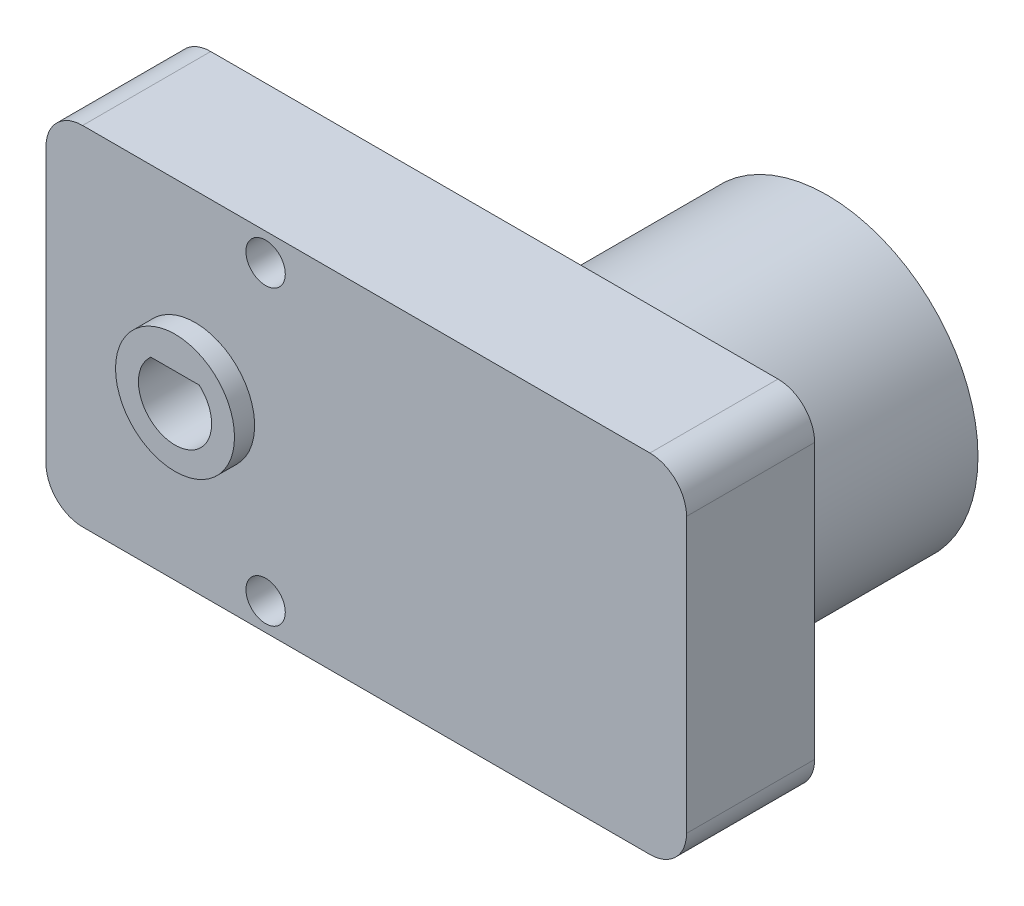
ISO-10303-21;
HEADER;
FILE_DESCRIPTION(('STEP AP214'),'2;1');
FILE_NAME('part.step','',(''),(''),'','','');
FILE_SCHEMA(('AUTOMOTIVE_DESIGN { 1 0 10303 214 1 1 1 1 }'));
ENDSEC;
DATA;
#1=APPLICATION_CONTEXT('core data for automotive mechanical design processes');
#2=APPLICATION_PROTOCOL_DEFINITION('international standard','automotive_design',2000,#1);
#3=PRODUCT_CONTEXT('',#1,'mechanical');
#4=PRODUCT('Part','Part','',(#3));
#5=PRODUCT_RELATED_PRODUCT_CATEGORY('part','',(#4));
#6=PRODUCT_DEFINITION_FORMATION('','',#4);
#7=PRODUCT_DEFINITION_CONTEXT('part definition',#1,'design');
#8=PRODUCT_DEFINITION('design','',#6,#7);
#9=PRODUCT_DEFINITION_SHAPE('','',#8);
#10=(LENGTH_UNIT() NAMED_UNIT(*) SI_UNIT(.MILLI.,.METRE.));
#11=(NAMED_UNIT(*) PLANE_ANGLE_UNIT() SI_UNIT($,.RADIAN.));
#12=(NAMED_UNIT(*) SI_UNIT($,.STERADIAN.) SOLID_ANGLE_UNIT());
#13=UNCERTAINTY_MEASURE_WITH_UNIT(LENGTH_MEASURE(1.E-05),#10,'distance_accuracy_value','');
#14=(GEOMETRIC_REPRESENTATION_CONTEXT(3) GLOBAL_UNCERTAINTY_ASSIGNED_CONTEXT((#13)) GLOBAL_UNIT_ASSIGNED_CONTEXT((#10,
#11,#12)) REPRESENTATION_CONTEXT('',''));
#15=CARTESIAN_POINT('',(0.,0.,0.));
#16=DIRECTION('',(0.,0.,1.));
#17=DIRECTION('',(1.,0.,0.));
#18=AXIS2_PLACEMENT_3D('',#15,#16,#17);
#19=CARTESIAN_POINT('',(0.,0.,14.));
#20=DIRECTION('',(0.,0.,-1.));
#21=DIRECTION('',(-1.,0.,0.));
#22=AXIS2_PLACEMENT_3D('',#19,#20,#21);
#23=PLANE('',#22);
#24=DIRECTION('',(0.,-1.,0.));
#25=VECTOR('',#24,1.);
#26=CARTESIAN_POINT('',(0.,0.,14.));
#27=LINE('',#26,#25);
#28=CARTESIAN_POINT('',(0.,34.,14.));
#29=VERTEX_POINT('',#28);
#30=CARTESIAN_POINT('',(0.,4.,14.));
#31=VERTEX_POINT('',#30);
#32=EDGE_CURVE('E185',#29,#31,#27,.T.);
#33=ORIENTED_EDGE('',*,*,#32,.T.);
#34=CARTESIAN_POINT('',(4.,4.,14.));
#35=DIRECTION('',(0.,0.,-1.));
#36=DIRECTION('',(-1.,0.,0.));
#37=AXIS2_PLACEMENT_3D('',#34,#35,#36);
#38=CIRCLE('',#37,4.);
#39=CARTESIAN_POINT('',(4.,0.,14.));
#40=VERTEX_POINT('',#39);
#41=EDGE_CURVE('E247',#31,#40,#38,.F.);
#42=ORIENTED_EDGE('',*,*,#41,.T.);
#43=DIRECTION('',(1.,0.,0.));
#44=VECTOR('',#43,1.);
#45=CARTESIAN_POINT('',(0.,0.,14.));
#46=LINE('',#45,#44);
#47=CARTESIAN_POINT('',(66.,0.,14.));
#48=VERTEX_POINT('',#47);
#49=EDGE_CURVE('E189',#40,#48,#46,.T.);
#50=ORIENTED_EDGE('',*,*,#49,.T.);
#51=CARTESIAN_POINT('',(66.,4.,14.));
#52=DIRECTION('',(0.,0.,-1.));
#53=DIRECTION('',(-1.,0.,0.));
#54=AXIS2_PLACEMENT_3D('',#51,#52,#53);
#55=CIRCLE('',#54,4.);
#56=CARTESIAN_POINT('',(70.,4.,14.));
#57=VERTEX_POINT('',#56);
#58=EDGE_CURVE('E244',#48,#57,#55,.F.);
#59=ORIENTED_EDGE('',*,*,#58,.T.);
#60=DIRECTION('',(0.,1.,0.));
#61=VECTOR('',#60,1.);
#62=CARTESIAN_POINT('',(70.,0.,14.));
#63=LINE('',#62,#61);
#64=CARTESIAN_POINT('',(70.,34.,14.));
#65=VERTEX_POINT('',#64);
#66=EDGE_CURVE('E194',#57,#65,#63,.T.);
#67=ORIENTED_EDGE('',*,*,#66,.T.);
#68=CARTESIAN_POINT('',(66.,34.,14.));
#69=DIRECTION('',(0.,0.,-1.));
#70=DIRECTION('',(-1.,0.,0.));
#71=AXIS2_PLACEMENT_3D('',#68,#69,#70);
#72=CIRCLE('',#71,4.);
#73=CARTESIAN_POINT('',(66.,38.,14.));
#74=VERTEX_POINT('',#73);
#75=EDGE_CURVE('E61',#65,#74,#72,.F.);
#76=ORIENTED_EDGE('',*,*,#75,.T.);
#77=DIRECTION('',(-1.,0.,0.));
#78=VECTOR('',#77,1.);
#79=CARTESIAN_POINT('',(0.,38.,14.));
#80=LINE('',#79,#78);
#81=CARTESIAN_POINT('',(4.,38.,14.));
#82=VERTEX_POINT('',#81);
#83=EDGE_CURVE('E197',#74,#82,#80,.T.);
#84=ORIENTED_EDGE('',*,*,#83,.T.);
#85=CARTESIAN_POINT('',(4.,34.,14.));
#86=DIRECTION('',(0.,0.,-1.));
#87=DIRECTION('',(-1.,0.,0.));
#88=AXIS2_PLACEMENT_3D('',#85,#86,#87);
#89=CIRCLE('',#88,4.);
#90=EDGE_CURVE('E241',#82,#29,#89,.F.);
#91=ORIENTED_EDGE('',*,*,#90,.T.);
#92=EDGE_LOOP('',(#33,#42,#50,#59,#67,#76,#84,#91));
#93=FACE_BOUND('',#92,.T.);
#94=CARTESIAN_POINT('',(24.,35.,14.));
#95=DIRECTION('',(0.,0.,1.));
#96=DIRECTION('',(1.,0.,0.));
#97=AXIS2_PLACEMENT_3D('',#94,#95,#96);
#98=CIRCLE('',#97,2.15);
#99=CARTESIAN_POINT('',(26.15,35.,14.));
#100=VERTEX_POINT('',#99);
#101=EDGE_CURVE('E177',#100,#100,#98,.T.);
#102=ORIENTED_EDGE('',*,*,#101,.F.);
#103=EDGE_LOOP('',(#102));
#104=FACE_BOUND('',#103,.T.);
#105=CARTESIAN_POINT('',(24.,3.,14.));
#106=DIRECTION('',(0.,0.,1.));
#107=DIRECTION('',(1.,0.,0.));
#108=AXIS2_PLACEMENT_3D('',#105,#106,#107);
#109=CIRCLE('',#108,2.15);
#110=CARTESIAN_POINT('',(26.15,3.,14.));
#111=VERTEX_POINT('',#110);
#112=EDGE_CURVE('E169',#111,#111,#109,.T.);
#113=ORIENTED_EDGE('',*,*,#112,.F.);
#114=EDGE_LOOP('',(#113));
#115=FACE_BOUND('',#114,.T.);
#116=CARTESIAN_POINT('',(16.3,19.,14.));
#117=DIRECTION('',(0.,0.,-1.));
#118=DIRECTION('',(-1.,0.,0.));
#119=AXIS2_PLACEMENT_3D('',#116,#117,#118);
#120=CIRCLE('',#119,6.5);
#121=CARTESIAN_POINT('',(9.79999999999999,19.,14.));
#122=VERTEX_POINT('',#121);
#123=EDGE_CURVE('E11',#122,#122,#120,.F.);
#124=ORIENTED_EDGE('',*,*,#123,.F.);
#125=EDGE_LOOP('',(#124));
#126=FACE_BOUND('',#125,.T.);
#127=ADVANCED_FACE('F39',(#93,#104,#115,#126),#23,.F.);
#128=CARTESIAN_POINT('',(0.,0.,0.));
#129=DIRECTION('',(0.,0.,-1.));
#130=DIRECTION('',(-1.,0.,0.));
#131=AXIS2_PLACEMENT_3D('',#128,#129,#130);
#132=PLANE('',#131);
#133=CARTESIAN_POINT('',(24.,3.,0.));
#134=DIRECTION('',(0.,0.,1.));
#135=DIRECTION('',(1.,0.,0.));
#136=AXIS2_PLACEMENT_3D('',#133,#134,#135);
#137=CIRCLE('',#136,2.15);
#138=CARTESIAN_POINT('',(26.15,3.,0.));
#139=VERTEX_POINT('',#138);
#140=EDGE_CURVE('E168',#139,#139,#137,.T.);
#141=ORIENTED_EDGE('',*,*,#140,.T.);
#142=EDGE_LOOP('',(#141));
#143=FACE_BOUND('',#142,.T.);
#144=DIRECTION('',(1.,0.,0.));
#145=VECTOR('',#144,1.);
#146=CARTESIAN_POINT('',(0.,0.,0.));
#147=LINE('',#146,#145);
#148=CARTESIAN_POINT('',(4.,0.,0.));
#149=VERTEX_POINT('',#148);
#150=CARTESIAN_POINT('',(66.,0.,0.));
#151=VERTEX_POINT('',#150);
#152=EDGE_CURVE('E204',#149,#151,#147,.T.);
#153=ORIENTED_EDGE('',*,*,#152,.F.);
#154=CARTESIAN_POINT('',(4.,4.,0.));
#155=DIRECTION('',(0.,0.,-1.));
#156=DIRECTION('',(-1.,0.,0.));
#157=AXIS2_PLACEMENT_3D('',#154,#155,#156);
#158=CIRCLE('',#157,4.);
#159=CARTESIAN_POINT('',(0.,4.,0.));
#160=VERTEX_POINT('',#159);
#161=EDGE_CURVE('E229',#149,#160,#158,.T.);
#162=ORIENTED_EDGE('',*,*,#161,.T.);
#163=DIRECTION('',(0.,-1.,0.));
#164=VECTOR('',#163,1.);
#165=CARTESIAN_POINT('',(0.,0.,0.));
#166=LINE('',#165,#164);
#167=CARTESIAN_POINT('',(0.,34.,0.));
#168=VERTEX_POINT('',#167);
#169=EDGE_CURVE('E181',#168,#160,#166,.T.);
#170=ORIENTED_EDGE('',*,*,#169,.F.);
#171=CARTESIAN_POINT('',(4.,34.,0.));
#172=DIRECTION('',(0.,0.,-1.));
#173=DIRECTION('',(-1.,0.,0.));
#174=AXIS2_PLACEMENT_3D('',#171,#172,#173);
#175=CIRCLE('',#174,4.);
#176=CARTESIAN_POINT('',(4.,38.,0.));
#177=VERTEX_POINT('',#176);
#178=EDGE_CURVE('E223',#168,#177,#175,.T.);
#179=ORIENTED_EDGE('',*,*,#178,.T.);
#180=DIRECTION('',(-1.,0.,0.));
#181=VECTOR('',#180,1.);
#182=CARTESIAN_POINT('',(0.,38.,0.));
#183=LINE('',#182,#181);
#184=CARTESIAN_POINT('',(66.,38.,0.));
#185=VERTEX_POINT('',#184);
#186=EDGE_CURVE('E190',#185,#177,#183,.T.);
#187=ORIENTED_EDGE('',*,*,#186,.F.);
#188=CARTESIAN_POINT('',(66.,34.,0.));
#189=DIRECTION('',(0.,0.,-1.));
#190=DIRECTION('',(-1.,0.,0.));
#191=AXIS2_PLACEMENT_3D('',#188,#189,#190);
#192=CIRCLE('',#191,4.);
#193=CARTESIAN_POINT('',(70.,34.,0.));
#194=VERTEX_POINT('',#193);
#195=EDGE_CURVE('E220',#185,#194,#192,.T.);
#196=ORIENTED_EDGE('',*,*,#195,.T.);
#197=DIRECTION('',(0.,1.,0.));
#198=VECTOR('',#197,1.);
#199=CARTESIAN_POINT('',(70.,0.,0.));
#200=LINE('',#199,#198);
#201=CARTESIAN_POINT('',(70.,4.,0.));
#202=VERTEX_POINT('',#201);
#203=EDGE_CURVE('E208',#202,#194,#200,.T.);
#204=ORIENTED_EDGE('',*,*,#203,.F.);
#205=CARTESIAN_POINT('',(66.,4.,0.));
#206=DIRECTION('',(0.,0.,-1.));
#207=DIRECTION('',(-1.,0.,0.));
#208=AXIS2_PLACEMENT_3D('',#205,#206,#207);
#209=CIRCLE('',#208,4.);
#210=EDGE_CURVE('E226',#202,#151,#209,.T.);
#211=ORIENTED_EDGE('',*,*,#210,.T.);
#212=EDGE_LOOP('',(#153,#162,#170,#179,#187,#196,#204,#211));
#213=FACE_BOUND('',#212,.T.);
#214=CARTESIAN_POINT('',(24.,35.,0.));
#215=DIRECTION('',(0.,0.,1.));
#216=DIRECTION('',(1.,0.,0.));
#217=AXIS2_PLACEMENT_3D('',#214,#215,#216);
#218=CIRCLE('',#217,2.15);
#219=CARTESIAN_POINT('',(26.15,35.,0.));
#220=VERTEX_POINT('',#219);
#221=EDGE_CURVE('E173',#220,#220,#218,.T.);
#222=ORIENTED_EDGE('',*,*,#221,.T.);
#223=EDGE_LOOP('',(#222));
#224=FACE_BOUND('',#223,.T.);
#225=CARTESIAN_POINT('',(48.7537887487647,19.,0.));
#226=DIRECTION('',(0.,0.,-1.));
#227=DIRECTION('',(-1.,0.,0.));
#228=AXIS2_PLACEMENT_3D('',#225,#226,#227);
#229=CIRCLE('',#228,16.5);
#230=CARTESIAN_POINT('',(32.2537887487647,19.,0.));
#231=VERTEX_POINT('',#230);
#232=EDGE_CURVE('E156',#231,#231,#229,.T.);
#233=ORIENTED_EDGE('',*,*,#232,.F.);
#234=EDGE_LOOP('',(#233));
#235=FACE_BOUND('',#234,.T.);
#236=CARTESIAN_POINT('',(16.3,19.,0.));
#237=DIRECTION('',(0.,0.,-1.));
#238=DIRECTION('',(-1.,0.,0.));
#239=AXIS2_PLACEMENT_3D('',#236,#237,#238);
#240=CIRCLE('',#239,6.5);
#241=CARTESIAN_POINT('',(9.8,19.,0.));
#242=VERTEX_POINT('',#241);
#243=EDGE_CURVE('E151',#242,#242,#240,.T.);
#244=ORIENTED_EDGE('',*,*,#243,.F.);
#245=EDGE_LOOP('',(#244));
#246=FACE_BOUND('',#245,.T.);
#247=ADVANCED_FACE('F267',(#143,#213,#224,#235,#246),#132,.T.);
#248=CARTESIAN_POINT('',(0.,0.,14.));
#249=DIRECTION('',(1.,0.,0.));
#250=DIRECTION('',(0.,0.,-1.));
#251=AXIS2_PLACEMENT_3D('',#248,#249,#250);
#252=PLANE('',#251);
#253=ORIENTED_EDGE('',*,*,#169,.T.);
#254=DIRECTION('',(0.,0.,-1.));
#255=VECTOR('',#254,1.);
#256=CARTESIAN_POINT('',(0.,4.,14.));
#257=LINE('',#256,#255);
#258=EDGE_CURVE('E236',#160,#31,#257,.F.);
#259=ORIENTED_EDGE('',*,*,#258,.T.);
#260=ORIENTED_EDGE('',*,*,#32,.F.);
#261=DIRECTION('',(0.,0.,-1.));
#262=VECTOR('',#261,1.);
#263=CARTESIAN_POINT('',(0.,34.,14.));
#264=LINE('',#263,#262);
#265=EDGE_CURVE('E232',#29,#168,#264,.T.);
#266=ORIENTED_EDGE('',*,*,#265,.T.);
#267=EDGE_LOOP('',(#253,#259,#260,#266));
#268=FACE_BOUND('',#267,.T.);
#269=ADVANCED_FACE('F277',(#268),#252,.F.);
#270=CARTESIAN_POINT('',(0.,0.,14.));
#271=DIRECTION('',(0.,1.,0.));
#272=DIRECTION('',(0.,0.,1.));
#273=AXIS2_PLACEMENT_3D('',#270,#271,#272);
#274=PLANE('',#273);
#275=ORIENTED_EDGE('',*,*,#49,.F.);
#276=DIRECTION('',(0.,0.,-1.));
#277=VECTOR('',#276,1.);
#278=CARTESIAN_POINT('',(4.,0.,14.));
#279=LINE('',#278,#277);
#280=EDGE_CURVE('E216',#40,#149,#279,.T.);
#281=ORIENTED_EDGE('',*,*,#280,.T.);
#282=ORIENTED_EDGE('',*,*,#152,.T.);
#283=DIRECTION('',(0.,0.,-1.));
#284=VECTOR('',#283,1.);
#285=CARTESIAN_POINT('',(66.,0.,14.));
#286=LINE('',#285,#284);
#287=EDGE_CURVE('E200',#151,#48,#286,.F.);
#288=ORIENTED_EDGE('',*,*,#287,.T.);
#289=EDGE_LOOP('',(#275,#281,#282,#288));
#290=FACE_BOUND('',#289,.T.);
#291=ADVANCED_FACE('F286',(#290),#274,.F.);
#292=CARTESIAN_POINT('',(70.,0.,14.));
#293=DIRECTION('',(-1.,0.,0.));
#294=DIRECTION('',(0.,0.,1.));
#295=AXIS2_PLACEMENT_3D('',#292,#293,#294);
#296=PLANE('',#295);
#297=ORIENTED_EDGE('',*,*,#66,.F.);
#298=DIRECTION('',(0.,0.,-1.));
#299=VECTOR('',#298,1.);
#300=CARTESIAN_POINT('',(70.,4.,14.));
#301=LINE('',#300,#299);
#302=EDGE_CURVE('E253',#57,#202,#301,.T.);
#303=ORIENTED_EDGE('',*,*,#302,.T.);
#304=ORIENTED_EDGE('',*,*,#203,.T.);
#305=DIRECTION('',(0.,0.,-1.));
#306=VECTOR('',#305,1.);
#307=CARTESIAN_POINT('',(70.,34.,14.));
#308=LINE('',#307,#306);
#309=EDGE_CURVE('E250',#194,#65,#308,.F.);
#310=ORIENTED_EDGE('',*,*,#309,.T.);
#311=EDGE_LOOP('',(#297,#303,#304,#310));
#312=FACE_BOUND('',#311,.T.);
#313=ADVANCED_FACE('F294',(#312),#296,.F.);
#314=CARTESIAN_POINT('',(0.,38.,14.));
#315=DIRECTION('',(0.,-1.,0.));
#316=DIRECTION('',(0.,0.,-1.));
#317=AXIS2_PLACEMENT_3D('',#314,#315,#316);
#318=PLANE('',#317);
#319=ORIENTED_EDGE('',*,*,#186,.T.);
#320=DIRECTION('',(0.,0.,-1.));
#321=VECTOR('',#320,1.);
#322=CARTESIAN_POINT('',(4.,38.,14.));
#323=LINE('',#322,#321);
#324=EDGE_CURVE('E48',#177,#82,#323,.F.);
#325=ORIENTED_EDGE('',*,*,#324,.T.);
#326=ORIENTED_EDGE('',*,*,#83,.F.);
#327=DIRECTION('',(0.,0.,-1.));
#328=VECTOR('',#327,1.);
#329=CARTESIAN_POINT('',(66.,38.,14.));
#330=LINE('',#329,#328);
#331=EDGE_CURVE('E257',#74,#185,#330,.T.);
#332=ORIENTED_EDGE('',*,*,#331,.T.);
#333=EDGE_LOOP('',(#319,#325,#326,#332));
#334=FACE_BOUND('',#333,.T.);
#335=ADVANCED_FACE('F263',(#334),#318,.F.);
#336=CARTESIAN_POINT('',(24.,35.,14.));
#337=DIRECTION('',(0.,0.,-1.));
#338=DIRECTION('',(-1.,0.,0.));
#339=AXIS2_PLACEMENT_3D('',#336,#337,#338);
#340=CYLINDRICAL_SURFACE('',#339,2.15);
#341=ORIENTED_EDGE('',*,*,#101,.T.);
#342=EDGE_LOOP('',(#341));
#343=FACE_BOUND('',#342,.T.);
#344=ORIENTED_EDGE('',*,*,#221,.F.);
#345=EDGE_LOOP('',(#344));
#346=FACE_BOUND('',#345,.T.);
#347=ADVANCED_FACE('F313',(#343,#346),#340,.F.);
#348=CARTESIAN_POINT('',(24.,3.,14.));
#349=DIRECTION('',(0.,0.,-1.));
#350=DIRECTION('',(-1.,0.,0.));
#351=AXIS2_PLACEMENT_3D('',#348,#349,#350);
#352=CYLINDRICAL_SURFACE('',#351,2.15);
#353=ORIENTED_EDGE('',*,*,#112,.T.);
#354=EDGE_LOOP('',(#353));
#355=FACE_BOUND('',#354,.T.);
#356=ORIENTED_EDGE('',*,*,#140,.F.);
#357=EDGE_LOOP('',(#356));
#358=FACE_BOUND('',#357,.T.);
#359=ADVANCED_FACE('F397',(#355,#358),#352,.F.);
#360=CARTESIAN_POINT('',(16.3,19.,14.));
#361=DIRECTION('',(0.,0.,-1.));
#362=DIRECTION('',(-1.,0.,0.));
#363=AXIS2_PLACEMENT_3D('',#360,#361,#362);
#364=CYLINDRICAL_SURFACE('',#363,4.);
#365=DIRECTION('',(0.,0.,-1.));
#366=VECTOR('',#365,1.);
#367=CARTESIAN_POINT('',(18.9457513110646,22.,14.));
#368=LINE('',#367,#366);
#369=CARTESIAN_POINT('',(18.9457513110646,22.,16.2));
#370=VERTEX_POINT('',#369);
#371=CARTESIAN_POINT('',(18.9457513110646,22.,-2.2));
#372=VERTEX_POINT('',#371);
#373=EDGE_CURVE('E130',#370,#372,#368,.T.);
#374=ORIENTED_EDGE('',*,*,#373,.T.);
#375=CARTESIAN_POINT('',(16.3,19.,-2.2));
#376=DIRECTION('',(0.,0.,-1.));
#377=DIRECTION('',(-1.,0.,0.));
#378=AXIS2_PLACEMENT_3D('',#375,#376,#377);
#379=CIRCLE('',#378,4.);
#380=CARTESIAN_POINT('',(13.6542486889354,22.,-2.2));
#381=VERTEX_POINT('',#380);
#382=EDGE_CURVE('E125',#372,#381,#379,.T.);
#383=ORIENTED_EDGE('',*,*,#382,.T.);
#384=DIRECTION('',(0.,0.,-1.));
#385=VECTOR('',#384,1.);
#386=CARTESIAN_POINT('',(13.6542486889354,22.,14.));
#387=LINE('',#386,#385);
#388=CARTESIAN_POINT('',(13.6542486889354,22.,16.2));
#389=VERTEX_POINT('',#388);
#390=EDGE_CURVE('E118',#389,#381,#387,.T.);
#391=ORIENTED_EDGE('',*,*,#390,.F.);
#392=CARTESIAN_POINT('',(16.3,19.,16.2));
#393=DIRECTION('',(0.,0.,1.));
#394=DIRECTION('',(1.,0.,0.));
#395=AXIS2_PLACEMENT_3D('',#392,#393,#394);
#396=CIRCLE('',#395,4.);
#397=EDGE_CURVE('E122',#389,#370,#396,.T.);
#398=ORIENTED_EDGE('',*,*,#397,.T.);
#399=EDGE_LOOP('',(#374,#383,#391,#398));
#400=FACE_BOUND('',#399,.T.);
#401=ADVANCED_FACE('F120',(#400),#364,.F.);
#402=CARTESIAN_POINT('',(13.6542486889354,22.,14.));
#403=DIRECTION('',(0.,-1.,0.));
#404=DIRECTION('',(0.,0.,-1.));
#405=AXIS2_PLACEMENT_3D('',#402,#403,#404);
#406=PLANE('',#405);
#407=ORIENTED_EDGE('',*,*,#390,.T.);
#408=DIRECTION('',(1.,0.,0.));
#409=VECTOR('',#408,1.);
#410=CARTESIAN_POINT('',(18.9457513110646,22.,-2.2));
#411=LINE('',#410,#409);
#412=EDGE_CURVE('E148',#381,#372,#411,.T.);
#413=ORIENTED_EDGE('',*,*,#412,.T.);
#414=ORIENTED_EDGE('',*,*,#373,.F.);
#415=DIRECTION('',(-1.,0.,0.));
#416=VECTOR('',#415,1.);
#417=CARTESIAN_POINT('',(13.6542486889354,22.,16.2));
#418=LINE('',#417,#416);
#419=EDGE_CURVE('E133',#370,#389,#418,.T.);
#420=ORIENTED_EDGE('',*,*,#419,.T.);
#421=EDGE_LOOP('',(#407,#413,#414,#420));
#422=FACE_BOUND('',#421,.T.);
#423=ADVANCED_FACE('F134',(#422),#406,.T.);
#424=CARTESIAN_POINT('',(4.,4.,14.));
#425=DIRECTION('',(0.,0.,-1.));
#426=DIRECTION('',(-1.,0.,0.));
#427=AXIS2_PLACEMENT_3D('',#424,#425,#426);
#428=CYLINDRICAL_SURFACE('',#427,4.);
#429=ORIENTED_EDGE('',*,*,#41,.F.);
#430=ORIENTED_EDGE('',*,*,#258,.F.);
#431=ORIENTED_EDGE('',*,*,#161,.F.);
#432=ORIENTED_EDGE('',*,*,#280,.F.);
#433=EDGE_LOOP('',(#429,#430,#431,#432));
#434=FACE_BOUND('',#433,.T.);
#435=ADVANCED_FACE('F284',(#434),#428,.T.);
#436=CARTESIAN_POINT('',(66.,4.,14.));
#437=DIRECTION('',(0.,0.,-1.));
#438=DIRECTION('',(-1.,0.,0.));
#439=AXIS2_PLACEMENT_3D('',#436,#437,#438);
#440=CYLINDRICAL_SURFACE('',#439,4.);
#441=ORIENTED_EDGE('',*,*,#58,.F.);
#442=ORIENTED_EDGE('',*,*,#287,.F.);
#443=ORIENTED_EDGE('',*,*,#210,.F.);
#444=ORIENTED_EDGE('',*,*,#302,.F.);
#445=EDGE_LOOP('',(#441,#442,#443,#444));
#446=FACE_BOUND('',#445,.T.);
#447=ADVANCED_FACE('F291',(#446),#440,.T.);
#448=CARTESIAN_POINT('',(4.,34.,14.));
#449=DIRECTION('',(0.,0.,-1.));
#450=DIRECTION('',(-1.,0.,0.));
#451=AXIS2_PLACEMENT_3D('',#448,#449,#450);
#452=CYLINDRICAL_SURFACE('',#451,4.);
#453=ORIENTED_EDGE('',*,*,#90,.F.);
#454=ORIENTED_EDGE('',*,*,#324,.F.);
#455=ORIENTED_EDGE('',*,*,#178,.F.);
#456=ORIENTED_EDGE('',*,*,#265,.F.);
#457=EDGE_LOOP('',(#453,#454,#455,#456));
#458=FACE_BOUND('',#457,.T.);
#459=ADVANCED_FACE('F274',(#458),#452,.T.);
#460=CARTESIAN_POINT('',(66.,34.,14.));
#461=DIRECTION('',(0.,0.,-1.));
#462=DIRECTION('',(-1.,0.,0.));
#463=AXIS2_PLACEMENT_3D('',#460,#461,#462);
#464=CYLINDRICAL_SURFACE('',#463,4.);
#465=ORIENTED_EDGE('',*,*,#75,.F.);
#466=ORIENTED_EDGE('',*,*,#309,.F.);
#467=ORIENTED_EDGE('',*,*,#195,.F.);
#468=ORIENTED_EDGE('',*,*,#331,.F.);
#469=EDGE_LOOP('',(#465,#466,#467,#468));
#470=FACE_BOUND('',#469,.T.);
#471=ADVANCED_FACE('F41',(#470),#464,.T.);
#472=CARTESIAN_POINT('',(48.7537887487647,19.,-22.6));
#473=DIRECTION('',(0.,0.,1.));
#474=DIRECTION('',(1.,0.,0.));
#475=AXIS2_PLACEMENT_3D('',#472,#473,#474);
#476=CYLINDRICAL_SURFACE('',#475,16.5);
#477=CARTESIAN_POINT('',(48.7537887487647,19.,-22.6));
#478=DIRECTION('',(0.,0.,-1.));
#479=DIRECTION('',(-1.,0.,0.));
#480=AXIS2_PLACEMENT_3D('',#477,#478,#479);
#481=CIRCLE('',#480,16.5);
#482=CARTESIAN_POINT('',(32.2537887487647,19.,-22.6));
#483=VERTEX_POINT('',#482);
#484=EDGE_CURVE('E131',#483,#483,#481,.T.);
#485=ORIENTED_EDGE('',*,*,#484,.F.);
#486=EDGE_LOOP('',(#485));
#487=FACE_BOUND('',#486,.T.);
#488=ORIENTED_EDGE('',*,*,#232,.T.);
#489=EDGE_LOOP('',(#488));
#490=FACE_BOUND('',#489,.T.);
#491=ADVANCED_FACE('F297',(#487,#490),#476,.T.);
#492=CARTESIAN_POINT('',(48.7537887487647,19.,-22.6));
#493=DIRECTION('',(0.,0.,-1.));
#494=DIRECTION('',(-1.,0.,0.));
#495=AXIS2_PLACEMENT_3D('',#492,#493,#494);
#496=PLANE('',#495);
#497=ORIENTED_EDGE('',*,*,#484,.T.);
#498=EDGE_LOOP('',(#497));
#499=FACE_BOUND('',#498,.T.);
#500=ADVANCED_FACE('F302',(#499),#496,.T.);
#501=CARTESIAN_POINT('',(16.3,19.,-2.2));
#502=DIRECTION('',(0.,0.,-1.));
#503=DIRECTION('',(-1.,0.,0.));
#504=AXIS2_PLACEMENT_3D('',#501,#502,#503);
#505=PLANE('',#504);
#506=CARTESIAN_POINT('',(16.3,19.,-2.2));
#507=DIRECTION('',(0.,0.,-1.));
#508=DIRECTION('',(-1.,0.,0.));
#509=AXIS2_PLACEMENT_3D('',#506,#507,#508);
#510=CIRCLE('',#509,6.5);
#511=CARTESIAN_POINT('',(9.8,19.,-2.2));
#512=VERTEX_POINT('',#511);
#513=EDGE_CURVE('E152',#512,#512,#510,.T.);
#514=ORIENTED_EDGE('',*,*,#513,.T.);
#515=EDGE_LOOP('',(#514));
#516=FACE_BOUND('',#515,.T.);
#517=ORIENTED_EDGE('',*,*,#412,.F.);
#518=ORIENTED_EDGE('',*,*,#382,.F.);
#519=EDGE_LOOP('',(#517,#518));
#520=FACE_BOUND('',#519,.T.);
#521=ADVANCED_FACE('F355',(#516,#520),#505,.T.);
#522=CARTESIAN_POINT('',(16.3,19.,-2.2));
#523=DIRECTION('',(0.,0.,1.));
#524=DIRECTION('',(1.,0.,0.));
#525=AXIS2_PLACEMENT_3D('',#522,#523,#524);
#526=CYLINDRICAL_SURFACE('',#525,6.5);
#527=ORIENTED_EDGE('',*,*,#513,.F.);
#528=EDGE_LOOP('',(#527));
#529=FACE_BOUND('',#528,.T.);
#530=ORIENTED_EDGE('',*,*,#243,.T.);
#531=EDGE_LOOP('',(#530));
#532=FACE_BOUND('',#531,.T.);
#533=ADVANCED_FACE('F372',(#529,#532),#526,.T.);
#534=CARTESIAN_POINT('',(16.3,19.,16.2));
#535=DIRECTION('',(0.,0.,1.));
#536=DIRECTION('',(1.,0.,0.));
#537=AXIS2_PLACEMENT_3D('',#534,#535,#536);
#538=PLANE('',#537);
#539=CARTESIAN_POINT('',(16.3,19.,16.2));
#540=DIRECTION('',(0.,0.,1.));
#541=DIRECTION('',(1.,0.,0.));
#542=AXIS2_PLACEMENT_3D('',#539,#540,#541);
#543=CIRCLE('',#542,6.5);
#544=CARTESIAN_POINT('',(22.8,19.,16.2));
#545=VERTEX_POINT('',#544);
#546=EDGE_CURVE('E137',#545,#545,#543,.T.);
#547=ORIENTED_EDGE('',*,*,#546,.T.);
#548=EDGE_LOOP('',(#547));
#549=FACE_BOUND('',#548,.T.);
#550=ORIENTED_EDGE('',*,*,#419,.F.);
#551=ORIENTED_EDGE('',*,*,#397,.F.);
#552=EDGE_LOOP('',(#550,#551));
#553=FACE_BOUND('',#552,.T.);
#554=ADVANCED_FACE('F139',(#549,#553),#538,.T.);
#555=CARTESIAN_POINT('',(16.3,19.,16.2));
#556=DIRECTION('',(0.,0.,-1.));
#557=DIRECTION('',(-1.,0.,0.));
#558=AXIS2_PLACEMENT_3D('',#555,#556,#557);
#559=CYLINDRICAL_SURFACE('',#558,6.5);
#560=ORIENTED_EDGE('',*,*,#546,.F.);
#561=EDGE_LOOP('',(#560));
#562=FACE_BOUND('',#561,.T.);
#563=ORIENTED_EDGE('',*,*,#123,.T.);
#564=EDGE_LOOP('',(#563));
#565=FACE_BOUND('',#564,.T.);
#566=ADVANCED_FACE('F413',(#562,#565),#559,.T.);
#567=CLOSED_SHELL('',(#127,#247,#269,#291,#313,#335,#347,#359,#401,#423,#435,#447,#459,#471,
#491,#500,#521,#533,#554,#566));
#568=MANIFOLD_SOLID_BREP('B2',#567);
#569=ADVANCED_BREP_SHAPE_REPRESENTATION('',(#18,#568),#14);
#570=SHAPE_DEFINITION_REPRESENTATION(#9,#569);
ENDSEC;
END-ISO-10303-21;
